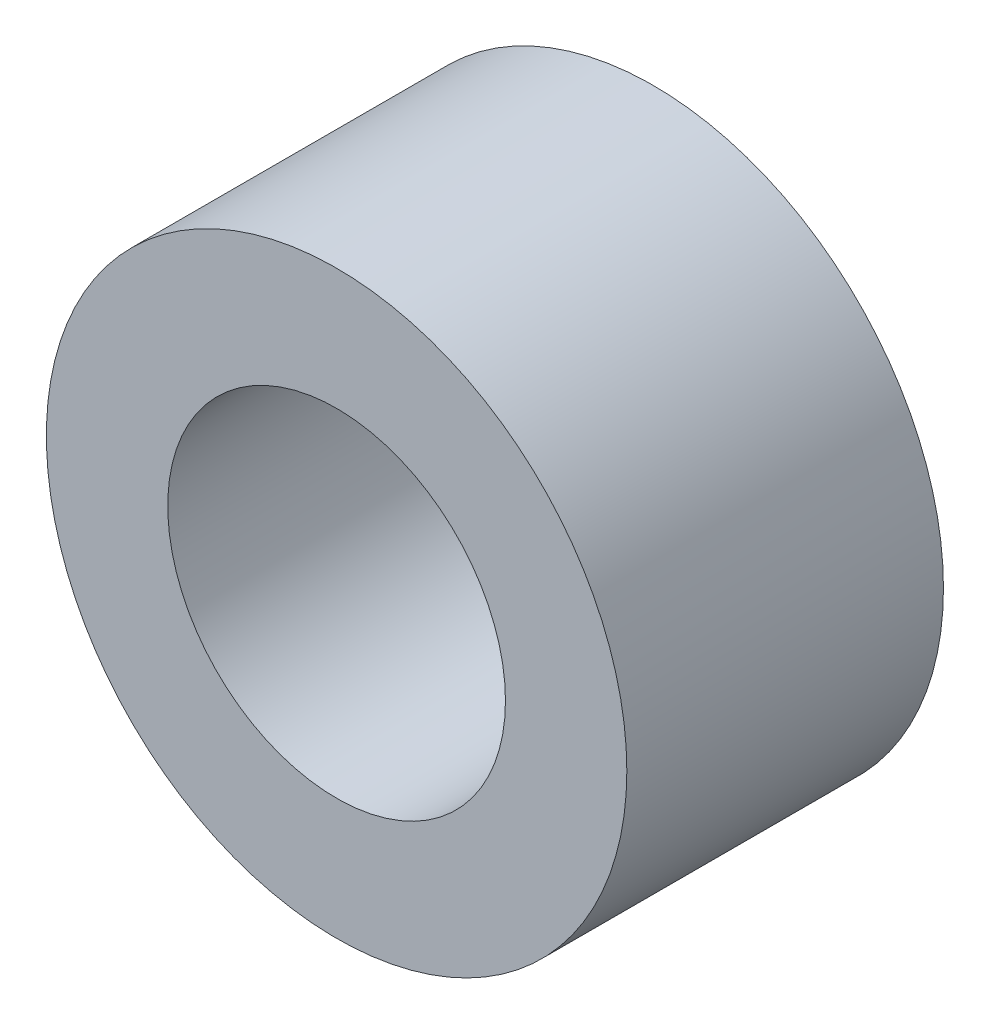
ISO-10303-21;
HEADER;
FILE_DESCRIPTION(('STEP AP214'),'2;1');
FILE_NAME('part.step','',(''),(''),'','','');
FILE_SCHEMA(('AUTOMOTIVE_DESIGN { 1 0 10303 214 1 1 1 1 }'));
ENDSEC;
DATA;
#1=APPLICATION_CONTEXT('core data for automotive mechanical design processes');
#2=APPLICATION_PROTOCOL_DEFINITION('international standard','automotive_design',2000,#1);
#3=PRODUCT_CONTEXT('',#1,'mechanical');
#4=PRODUCT('Part','Part','',(#3));
#5=PRODUCT_RELATED_PRODUCT_CATEGORY('part','',(#4));
#6=PRODUCT_DEFINITION_FORMATION('','',#4);
#7=PRODUCT_DEFINITION_CONTEXT('part definition',#1,'design');
#8=PRODUCT_DEFINITION('design','',#6,#7);
#9=PRODUCT_DEFINITION_SHAPE('','',#8);
#10=(LENGTH_UNIT() NAMED_UNIT(*) SI_UNIT(.MILLI.,.METRE.));
#11=(NAMED_UNIT(*) PLANE_ANGLE_UNIT() SI_UNIT($,.RADIAN.));
#12=(NAMED_UNIT(*) SI_UNIT($,.STERADIAN.) SOLID_ANGLE_UNIT());
#13=UNCERTAINTY_MEASURE_WITH_UNIT(LENGTH_MEASURE(1.E-05),#10,'distance_accuracy_value','');
#14=(GEOMETRIC_REPRESENTATION_CONTEXT(3) GLOBAL_UNCERTAINTY_ASSIGNED_CONTEXT((#13)) GLOBAL_UNIT_ASSIGNED_CONTEXT((#10,
#11,#12)) REPRESENTATION_CONTEXT('',''));
#15=CARTESIAN_POINT('',(0.,0.,0.));
#16=DIRECTION('',(0.,0.,1.));
#17=DIRECTION('',(1.,0.,0.));
#18=AXIS2_PLACEMENT_3D('',#15,#16,#17);
#19=CARTESIAN_POINT('',(0.,0.,3.));
#20=DIRECTION('',(0.,0.,1.));
#21=DIRECTION('',(1.,0.,0.));
#22=AXIS2_PLACEMENT_3D('',#19,#20,#21);
#23=PLANE('',#22);
#24=CARTESIAN_POINT('',(0.,0.,3.));
#25=DIRECTION('',(0.,0.,1.));
#26=DIRECTION('',(1.,0.,0.));
#27=AXIS2_PLACEMENT_3D('',#24,#25,#26);
#28=CIRCLE('',#27,2.75);
#29=CARTESIAN_POINT('',(2.75,0.,3.));
#30=VERTEX_POINT('',#29);
#31=EDGE_CURVE('E10',#30,#30,#28,.T.);
#32=ORIENTED_EDGE('',*,*,#31,.T.);
#33=EDGE_LOOP('',(#32));
#34=FACE_BOUND('',#33,.T.);
#35=CARTESIAN_POINT('',(0.,0.,3.));
#36=DIRECTION('',(0.,0.,1.));
#37=DIRECTION('',(1.,0.,0.));
#38=AXIS2_PLACEMENT_3D('',#35,#36,#37);
#39=CIRCLE('',#38,1.6);
#40=CARTESIAN_POINT('',(1.6,0.,3.));
#41=VERTEX_POINT('',#40);
#42=EDGE_CURVE('E48',#41,#41,#39,.T.);
#43=ORIENTED_EDGE('',*,*,#42,.F.);
#44=EDGE_LOOP('',(#43));
#45=FACE_BOUND('',#44,.T.);
#46=ADVANCED_FACE('F37',(#34,#45),#23,.T.);
#47=CARTESIAN_POINT('',(0.,0.,0.));
#48=DIRECTION('',(0.,0.,1.));
#49=DIRECTION('',(1.,0.,0.));
#50=AXIS2_PLACEMENT_3D('',#47,#48,#49);
#51=PLANE('',#50);
#52=CARTESIAN_POINT('',(0.,0.,0.));
#53=DIRECTION('',(0.,0.,1.));
#54=DIRECTION('',(1.,0.,0.));
#55=AXIS2_PLACEMENT_3D('',#52,#53,#54);
#56=CIRCLE('',#55,2.75);
#57=CARTESIAN_POINT('',(2.75,0.,0.));
#58=VERTEX_POINT('',#57);
#59=EDGE_CURVE('E41',#58,#58,#56,.T.);
#60=ORIENTED_EDGE('',*,*,#59,.F.);
#61=EDGE_LOOP('',(#60));
#62=FACE_BOUND('',#61,.T.);
#63=CARTESIAN_POINT('',(0.,0.,0.));
#64=DIRECTION('',(0.,0.,1.));
#65=DIRECTION('',(1.,0.,0.));
#66=AXIS2_PLACEMENT_3D('',#63,#64,#65);
#67=CIRCLE('',#66,1.6);
#68=CARTESIAN_POINT('',(1.6,0.,0.));
#69=VERTEX_POINT('',#68);
#70=EDGE_CURVE('E50',#69,#69,#67,.T.);
#71=ORIENTED_EDGE('',*,*,#70,.T.);
#72=EDGE_LOOP('',(#71));
#73=FACE_BOUND('',#72,.T.);
#74=ADVANCED_FACE('F60',(#62,#73),#51,.F.);
#75=CARTESIAN_POINT('',(0.,0.,3.));
#76=DIRECTION('',(0.,0.,-1.));
#77=DIRECTION('',(-1.,0.,0.));
#78=AXIS2_PLACEMENT_3D('',#75,#76,#77);
#79=CYLINDRICAL_SURFACE('',#78,2.75);
#80=ORIENTED_EDGE('',*,*,#31,.F.);
#81=EDGE_LOOP('',(#80));
#82=FACE_BOUND('',#81,.T.);
#83=ORIENTED_EDGE('',*,*,#59,.T.);
#84=EDGE_LOOP('',(#83));
#85=FACE_BOUND('',#84,.T.);
#86=ADVANCED_FACE('F39',(#82,#85),#79,.T.);
#87=CARTESIAN_POINT('',(0.,0.,3.));
#88=DIRECTION('',(0.,0.,-1.));
#89=DIRECTION('',(-1.,0.,0.));
#90=AXIS2_PLACEMENT_3D('',#87,#88,#89);
#91=CYLINDRICAL_SURFACE('',#90,1.6);
#92=ORIENTED_EDGE('',*,*,#42,.T.);
#93=EDGE_LOOP('',(#92));
#94=FACE_BOUND('',#93,.T.);
#95=ORIENTED_EDGE('',*,*,#70,.F.);
#96=EDGE_LOOP('',(#95));
#97=FACE_BOUND('',#96,.T.);
#98=ADVANCED_FACE('F56',(#94,#97),#91,.F.);
#99=CLOSED_SHELL('',(#46,#74,#86,#98));
#100=MANIFOLD_SOLID_BREP('B2',#99);
#101=ADVANCED_BREP_SHAPE_REPRESENTATION('',(#18,#100),#14);
#102=SHAPE_DEFINITION_REPRESENTATION(#9,#101);
ENDSEC;
END-ISO-10303-21;
